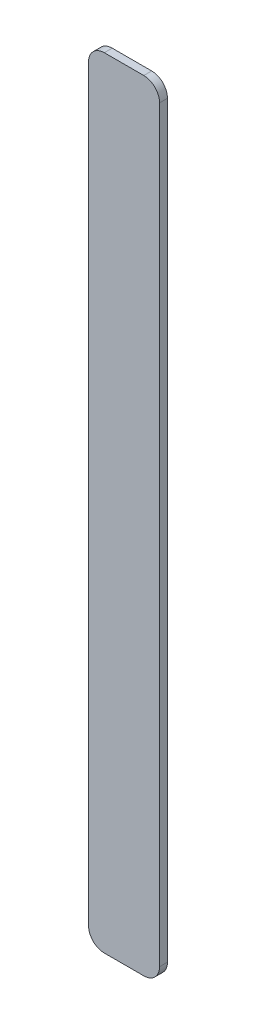
ISO-10303-21;
HEADER;
FILE_DESCRIPTION(('STEP AP214'),'2;1');
FILE_NAME('part.step','',(''),(''),'','','');
FILE_SCHEMA(('AUTOMOTIVE_DESIGN { 1 0 10303 214 1 1 1 1 }'));
ENDSEC;
DATA;
#1=APPLICATION_CONTEXT('core data for automotive mechanical design processes');
#2=APPLICATION_PROTOCOL_DEFINITION('international standard','automotive_design',2000,#1);
#3=PRODUCT_CONTEXT('',#1,'mechanical');
#4=PRODUCT('Part','Part','',(#3));
#5=PRODUCT_RELATED_PRODUCT_CATEGORY('part','',(#4));
#6=PRODUCT_DEFINITION_FORMATION('','',#4);
#7=PRODUCT_DEFINITION_CONTEXT('part definition',#1,'design');
#8=PRODUCT_DEFINITION('design','',#6,#7);
#9=PRODUCT_DEFINITION_SHAPE('','',#8);
#10=(LENGTH_UNIT() NAMED_UNIT(*) SI_UNIT(.MILLI.,.METRE.));
#11=(NAMED_UNIT(*) PLANE_ANGLE_UNIT() SI_UNIT($,.RADIAN.));
#12=(NAMED_UNIT(*) SI_UNIT($,.STERADIAN.) SOLID_ANGLE_UNIT());
#13=UNCERTAINTY_MEASURE_WITH_UNIT(LENGTH_MEASURE(1.E-05),#10,'distance_accuracy_value','');
#14=(GEOMETRIC_REPRESENTATION_CONTEXT(3) GLOBAL_UNCERTAINTY_ASSIGNED_CONTEXT((#13)) GLOBAL_UNIT_ASSIGNED_CONTEXT((#10,
#11,#12)) REPRESENTATION_CONTEXT('',''));
#15=CARTESIAN_POINT('',(0.,0.,0.));
#16=DIRECTION('',(0.,0.,1.));
#17=DIRECTION('',(1.,0.,0.));
#18=AXIS2_PLACEMENT_3D('',#15,#16,#17);
#19=CARTESIAN_POINT('',(-2.49999999999999,0.,0.5));
#20=DIRECTION('',(0.,0.,-1.));
#21=DIRECTION('',(-1.,0.,0.));
#22=AXIS2_PLACEMENT_3D('',#19,#20,#21);
#23=CYLINDRICAL_SURFACE('',#22,1.);
#24=CARTESIAN_POINT('',(-2.49999999999999,0.,0.));
#25=DIRECTION('',(0.,0.,1.));
#26=DIRECTION('',(1.,0.,0.));
#27=AXIS2_PLACEMENT_3D('',#24,#25,#26);
#28=CIRCLE('',#27,1.);
#29=CARTESIAN_POINT('',(-3.5,0.,0.));
#30=VERTEX_POINT('',#29);
#31=CARTESIAN_POINT('',(-2.49999999999999,-0.999999999999997,0.));
#32=VERTEX_POINT('',#31);
#33=EDGE_CURVE('E140',#30,#32,#28,.T.);
#34=ORIENTED_EDGE('',*,*,#33,.T.);
#35=DIRECTION('',(0.,0.,-1.));
#36=VECTOR('',#35,1.);
#37=CARTESIAN_POINT('',(-2.49999999999999,-0.999999999999997,0.5));
#38=LINE('',#37,#36);
#39=CARTESIAN_POINT('',(-2.49999999999999,-0.999999999999997,0.5));
#40=VERTEX_POINT('',#39);
#41=EDGE_CURVE('E11',#40,#32,#38,.T.);
#42=ORIENTED_EDGE('',*,*,#41,.F.);
#43=CARTESIAN_POINT('',(-2.49999999999999,0.,0.5));
#44=DIRECTION('',(0.,0.,1.));
#45=DIRECTION('',(1.,0.,0.));
#46=AXIS2_PLACEMENT_3D('',#43,#44,#45);
#47=CIRCLE('',#46,1.);
#48=CARTESIAN_POINT('',(-3.5,0.,0.5));
#49=VERTEX_POINT('',#48);
#50=EDGE_CURVE('E162',#49,#40,#47,.T.);
#51=ORIENTED_EDGE('',*,*,#50,.F.);
#52=DIRECTION('',(0.,0.,-1.));
#53=VECTOR('',#52,1.);
#54=CARTESIAN_POINT('',(-3.5,0.,0.5));
#55=LINE('',#54,#53);
#56=EDGE_CURVE('E136',#49,#30,#55,.T.);
#57=ORIENTED_EDGE('',*,*,#56,.T.);
#58=EDGE_LOOP('',(#34,#42,#51,#57));
#59=FACE_BOUND('',#58,.T.);
#60=ADVANCED_FACE('F39',(#59),#23,.T.);
#61=CARTESIAN_POINT('',(-2.49999999999999,-0.999999999999997,0.5));
#62=DIRECTION('',(0.,1.,0.));
#63=DIRECTION('',(0.,0.,1.));
#64=AXIS2_PLACEMENT_3D('',#61,#62,#63);
#65=PLANE('',#64);
#66=DIRECTION('',(1.,0.,0.));
#67=VECTOR('',#66,1.);
#68=CARTESIAN_POINT('',(-2.49999999999999,-0.999999999999997,0.));
#69=LINE('',#68,#67);
#70=CARTESIAN_POINT('',(0.,-0.999999999999997,0.));
#71=VERTEX_POINT('',#70);
#72=EDGE_CURVE('E144',#32,#71,#69,.T.);
#73=ORIENTED_EDGE('',*,*,#72,.T.);
#74=DIRECTION('',(0.,0.,-1.));
#75=VECTOR('',#74,1.);
#76=CARTESIAN_POINT('',(0.,-0.999999999999997,0.5));
#77=LINE('',#76,#75);
#78=CARTESIAN_POINT('',(0.,-0.999999999999997,0.5));
#79=VERTEX_POINT('',#78);
#80=EDGE_CURVE('E48',#79,#71,#77,.T.);
#81=ORIENTED_EDGE('',*,*,#80,.F.);
#82=DIRECTION('',(1.,0.,0.));
#83=VECTOR('',#82,1.);
#84=CARTESIAN_POINT('',(-2.49999999999999,-0.999999999999997,0.5));
#85=LINE('',#84,#83);
#86=EDGE_CURVE('E99',#40,#79,#85,.T.);
#87=ORIENTED_EDGE('',*,*,#86,.F.);
#88=ORIENTED_EDGE('',*,*,#41,.T.);
#89=EDGE_LOOP('',(#73,#81,#87,#88));
#90=FACE_BOUND('',#89,.T.);
#91=ADVANCED_FACE('F208',(#90),#65,.F.);
#92=CARTESIAN_POINT('',(0.,0.,0.5));
#93=DIRECTION('',(0.,0.,-1.));
#94=DIRECTION('',(-1.,0.,0.));
#95=AXIS2_PLACEMENT_3D('',#92,#93,#94);
#96=CYLINDRICAL_SURFACE('',#95,1.);
#97=CARTESIAN_POINT('',(0.,0.,0.));
#98=DIRECTION('',(0.,0.,1.));
#99=DIRECTION('',(1.,0.,0.));
#100=AXIS2_PLACEMENT_3D('',#97,#98,#99);
#101=CIRCLE('',#100,1.);
#102=CARTESIAN_POINT('',(1.,0.,0.));
#103=VERTEX_POINT('',#102);
#104=EDGE_CURVE('E147',#71,#103,#101,.T.);
#105=ORIENTED_EDGE('',*,*,#104,.T.);
#106=DIRECTION('',(0.,0.,-1.));
#107=VECTOR('',#106,1.);
#108=CARTESIAN_POINT('',(1.,0.,0.5));
#109=LINE('',#108,#107);
#110=CARTESIAN_POINT('',(1.,0.,0.5));
#111=VERTEX_POINT('',#110);
#112=EDGE_CURVE('E173',#111,#103,#109,.T.);
#113=ORIENTED_EDGE('',*,*,#112,.F.);
#114=CARTESIAN_POINT('',(0.,0.,0.5));
#115=DIRECTION('',(0.,0.,1.));
#116=DIRECTION('',(1.,0.,0.));
#117=AXIS2_PLACEMENT_3D('',#114,#115,#116);
#118=CIRCLE('',#117,1.);
#119=EDGE_CURVE('E183',#79,#111,#118,.T.);
#120=ORIENTED_EDGE('',*,*,#119,.F.);
#121=ORIENTED_EDGE('',*,*,#80,.T.);
#122=EDGE_LOOP('',(#105,#113,#120,#121));
#123=FACE_BOUND('',#122,.T.);
#124=ADVANCED_FACE('F181',(#123),#96,.T.);
#125=CARTESIAN_POINT('',(1.,0.,0.5));
#126=DIRECTION('',(-1.,0.,0.));
#127=DIRECTION('',(0.,0.,1.));
#128=AXIS2_PLACEMENT_3D('',#125,#126,#127);
#129=PLANE('',#128);
#130=DIRECTION('',(0.,1.,0.));
#131=VECTOR('',#130,1.);
#132=CARTESIAN_POINT('',(1.,0.,0.));
#133=LINE('',#132,#131);
#134=CARTESIAN_POINT('',(1.,47.4,0.));
#135=VERTEX_POINT('',#134);
#136=EDGE_CURVE('E150',#103,#135,#133,.T.);
#137=ORIENTED_EDGE('',*,*,#136,.T.);
#138=DIRECTION('',(0.,0.,-1.));
#139=VECTOR('',#138,1.);
#140=CARTESIAN_POINT('',(1.,47.4,0.5));
#141=LINE('',#140,#139);
#142=CARTESIAN_POINT('',(1.,47.4,0.5));
#143=VERTEX_POINT('',#142);
#144=EDGE_CURVE('E169',#143,#135,#141,.T.);
#145=ORIENTED_EDGE('',*,*,#144,.F.);
#146=DIRECTION('',(0.,1.,0.));
#147=VECTOR('',#146,1.);
#148=CARTESIAN_POINT('',(1.,0.,0.5));
#149=LINE('',#148,#147);
#150=EDGE_CURVE('E196',#111,#143,#149,.T.);
#151=ORIENTED_EDGE('',*,*,#150,.F.);
#152=ORIENTED_EDGE('',*,*,#112,.T.);
#153=EDGE_LOOP('',(#137,#145,#151,#152));
#154=FACE_BOUND('',#153,.T.);
#155=ADVANCED_FACE('F191',(#154),#129,.F.);
#156=CARTESIAN_POINT('',(0.,47.4,0.5));
#157=DIRECTION('',(0.,0.,-1.));
#158=DIRECTION('',(-1.,0.,0.));
#159=AXIS2_PLACEMENT_3D('',#156,#157,#158);
#160=CYLINDRICAL_SURFACE('',#159,1.);
#161=CARTESIAN_POINT('',(0.,47.4,0.));
#162=DIRECTION('',(0.,0.,1.));
#163=DIRECTION('',(1.,0.,0.));
#164=AXIS2_PLACEMENT_3D('',#161,#162,#163);
#165=CIRCLE('',#164,1.);
#166=CARTESIAN_POINT('',(0.,48.4,0.));
#167=VERTEX_POINT('',#166);
#168=EDGE_CURVE('E153',#135,#167,#165,.T.);
#169=ORIENTED_EDGE('',*,*,#168,.T.);
#170=DIRECTION('',(0.,0.,-1.));
#171=VECTOR('',#170,1.);
#172=CARTESIAN_POINT('',(0.,48.4,0.5));
#173=LINE('',#172,#171);
#174=CARTESIAN_POINT('',(0.,48.4,0.5));
#175=VERTEX_POINT('',#174);
#176=EDGE_CURVE('E129',#175,#167,#173,.T.);
#177=ORIENTED_EDGE('',*,*,#176,.F.);
#178=CARTESIAN_POINT('',(0.,47.4,0.5));
#179=DIRECTION('',(0.,0.,1.));
#180=DIRECTION('',(1.,0.,0.));
#181=AXIS2_PLACEMENT_3D('',#178,#179,#180);
#182=CIRCLE('',#181,1.);
#183=EDGE_CURVE('E118',#143,#175,#182,.T.);
#184=ORIENTED_EDGE('',*,*,#183,.F.);
#185=ORIENTED_EDGE('',*,*,#144,.T.);
#186=EDGE_LOOP('',(#169,#177,#184,#185));
#187=FACE_BOUND('',#186,.T.);
#188=ADVANCED_FACE('F194',(#187),#160,.T.);
#189=CARTESIAN_POINT('',(0.,48.4,0.5));
#190=DIRECTION('',(0.,-1.,0.));
#191=DIRECTION('',(0.,0.,-1.));
#192=AXIS2_PLACEMENT_3D('',#189,#190,#191);
#193=PLANE('',#192);
#194=DIRECTION('',(-1.,0.,0.));
#195=VECTOR('',#194,1.);
#196=CARTESIAN_POINT('',(0.,48.4,0.));
#197=LINE('',#196,#195);
#198=CARTESIAN_POINT('',(-2.5,48.4,0.));
#199=VERTEX_POINT('',#198);
#200=EDGE_CURVE('E127',#167,#199,#197,.T.);
#201=ORIENTED_EDGE('',*,*,#200,.T.);
#202=DIRECTION('',(0.,0.,-1.));
#203=VECTOR('',#202,1.);
#204=CARTESIAN_POINT('',(-2.5,48.4,0.5));
#205=LINE('',#204,#203);
#206=CARTESIAN_POINT('',(-2.5,48.4,0.5));
#207=VERTEX_POINT('',#206);
#208=EDGE_CURVE('E124',#207,#199,#205,.T.);
#209=ORIENTED_EDGE('',*,*,#208,.F.);
#210=DIRECTION('',(-1.,0.,0.));
#211=VECTOR('',#210,1.);
#212=CARTESIAN_POINT('',(0.,48.4,0.5));
#213=LINE('',#212,#211);
#214=EDGE_CURVE('E112',#175,#207,#213,.T.);
#215=ORIENTED_EDGE('',*,*,#214,.F.);
#216=ORIENTED_EDGE('',*,*,#176,.T.);
#217=EDGE_LOOP('',(#201,#209,#215,#216));
#218=FACE_BOUND('',#217,.T.);
#219=ADVANCED_FACE('F125',(#218),#193,.F.);
#220=CARTESIAN_POINT('',(-2.5,47.4,0.5));
#221=DIRECTION('',(0.,0.,-1.));
#222=DIRECTION('',(-1.,0.,0.));
#223=AXIS2_PLACEMENT_3D('',#220,#221,#222);
#224=CYLINDRICAL_SURFACE('',#223,1.);
#225=CARTESIAN_POINT('',(-2.5,47.4,0.));
#226=DIRECTION('',(0.,0.,1.));
#227=DIRECTION('',(1.,0.,0.));
#228=AXIS2_PLACEMENT_3D('',#225,#226,#227);
#229=CIRCLE('',#228,1.);
#230=CARTESIAN_POINT('',(-3.5,47.4,0.));
#231=VERTEX_POINT('',#230);
#232=EDGE_CURVE('E85',#199,#231,#229,.T.);
#233=ORIENTED_EDGE('',*,*,#232,.T.);
#234=DIRECTION('',(0.,0.,-1.));
#235=VECTOR('',#234,1.);
#236=CARTESIAN_POINT('',(-3.5,47.4,0.5));
#237=LINE('',#236,#235);
#238=CARTESIAN_POINT('',(-3.5,47.4,0.5));
#239=VERTEX_POINT('',#238);
#240=EDGE_CURVE('E130',#239,#231,#237,.T.);
#241=ORIENTED_EDGE('',*,*,#240,.F.);
#242=CARTESIAN_POINT('',(-2.5,47.4,0.5));
#243=DIRECTION('',(0.,0.,1.));
#244=DIRECTION('',(1.,0.,0.));
#245=AXIS2_PLACEMENT_3D('',#242,#243,#244);
#246=CIRCLE('',#245,1.);
#247=EDGE_CURVE('E116',#207,#239,#246,.T.);
#248=ORIENTED_EDGE('',*,*,#247,.F.);
#249=ORIENTED_EDGE('',*,*,#208,.T.);
#250=EDGE_LOOP('',(#233,#241,#248,#249));
#251=FACE_BOUND('',#250,.T.);
#252=ADVANCED_FACE('F132',(#251),#224,.T.);
#253=CARTESIAN_POINT('',(-3.5,47.4,0.5));
#254=DIRECTION('',(1.,0.,0.));
#255=DIRECTION('',(0.,1.,0.));
#256=AXIS2_PLACEMENT_3D('',#253,#254,#255);
#257=PLANE('',#256);
#258=DIRECTION('',(0.,-1.,0.));
#259=VECTOR('',#258,1.);
#260=CARTESIAN_POINT('',(-3.5,47.4,0.));
#261=LINE('',#260,#259);
#262=EDGE_CURVE('E91',#231,#30,#261,.T.);
#263=ORIENTED_EDGE('',*,*,#262,.T.);
#264=ORIENTED_EDGE('',*,*,#56,.F.);
#265=DIRECTION('',(0.,-1.,0.));
#266=VECTOR('',#265,1.);
#267=CARTESIAN_POINT('',(-3.5,47.4,0.5));
#268=LINE('',#267,#266);
#269=EDGE_CURVE('E56',#239,#49,#268,.T.);
#270=ORIENTED_EDGE('',*,*,#269,.F.);
#271=ORIENTED_EDGE('',*,*,#240,.T.);
#272=EDGE_LOOP('',(#263,#264,#270,#271));
#273=FACE_BOUND('',#272,.T.);
#274=ADVANCED_FACE('F224',(#273),#257,.F.);
#275=CARTESIAN_POINT('',(-2.49999999999999,0.,0.5));
#276=DIRECTION('',(0.,0.,1.));
#277=DIRECTION('',(1.,0.,0.));
#278=AXIS2_PLACEMENT_3D('',#275,#276,#277);
#279=PLANE('',#278);
#280=ORIENTED_EDGE('',*,*,#50,.T.);
#281=ORIENTED_EDGE('',*,*,#86,.T.);
#282=ORIENTED_EDGE('',*,*,#119,.T.);
#283=ORIENTED_EDGE('',*,*,#150,.T.);
#284=ORIENTED_EDGE('',*,*,#183,.T.);
#285=ORIENTED_EDGE('',*,*,#214,.T.);
#286=ORIENTED_EDGE('',*,*,#247,.T.);
#287=ORIENTED_EDGE('',*,*,#269,.T.);
#288=EDGE_LOOP('',(#280,#281,#282,#283,#284,#285,#286,#287));
#289=FACE_BOUND('',#288,.T.);
#290=ADVANCED_FACE('F114',(#289),#279,.T.);
#291=CARTESIAN_POINT('',(-2.49999999999999,0.,0.));
#292=DIRECTION('',(0.,0.,1.));
#293=DIRECTION('',(1.,0.,0.));
#294=AXIS2_PLACEMENT_3D('',#291,#292,#293);
#295=PLANE('',#294);
#296=ORIENTED_EDGE('',*,*,#33,.F.);
#297=ORIENTED_EDGE('',*,*,#262,.F.);
#298=ORIENTED_EDGE('',*,*,#232,.F.);
#299=ORIENTED_EDGE('',*,*,#200,.F.);
#300=ORIENTED_EDGE('',*,*,#168,.F.);
#301=ORIENTED_EDGE('',*,*,#136,.F.);
#302=ORIENTED_EDGE('',*,*,#104,.F.);
#303=ORIENTED_EDGE('',*,*,#72,.F.);
#304=EDGE_LOOP('',(#296,#297,#298,#299,#300,#301,#302,#303));
#305=FACE_BOUND('',#304,.T.);
#306=ADVANCED_FACE('F187',(#305),#295,.F.);
#307=CLOSED_SHELL('',(#60,#91,#124,#155,#188,#219,#252,#274,#290,#306));
#308=MANIFOLD_SOLID_BREP('B2',#307);
#309=ADVANCED_BREP_SHAPE_REPRESENTATION('',(#18,#308),#14);
#310=SHAPE_DEFINITION_REPRESENTATION(#9,#309);
ENDSEC;
END-ISO-10303-21;
